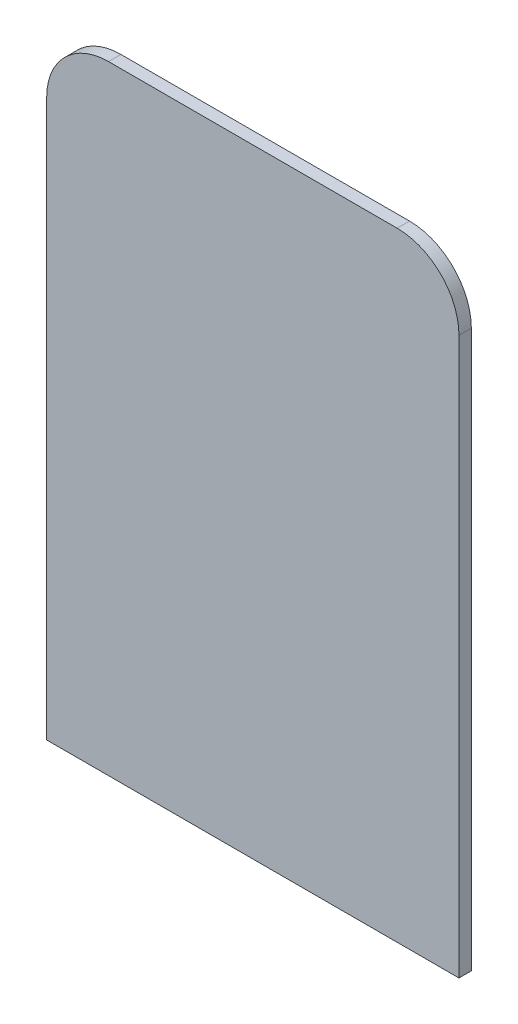
ISO-10303-21;
HEADER;
FILE_DESCRIPTION(('STEP AP214'),'2;1');
FILE_NAME('part.step','',(''),(''),'','','');
FILE_SCHEMA(('AUTOMOTIVE_DESIGN { 1 0 10303 214 1 1 1 1 }'));
ENDSEC;
DATA;
#1=APPLICATION_CONTEXT('core data for automotive mechanical design processes');
#2=APPLICATION_PROTOCOL_DEFINITION('international standard','automotive_design',2000,#1);
#3=PRODUCT_CONTEXT('',#1,'mechanical');
#4=PRODUCT('Part','Part','',(#3));
#5=PRODUCT_RELATED_PRODUCT_CATEGORY('part','',(#4));
#6=PRODUCT_DEFINITION_FORMATION('','',#4);
#7=PRODUCT_DEFINITION_CONTEXT('part definition',#1,'design');
#8=PRODUCT_DEFINITION('design','',#6,#7);
#9=PRODUCT_DEFINITION_SHAPE('','',#8);
#10=(LENGTH_UNIT() NAMED_UNIT(*) SI_UNIT(.MILLI.,.METRE.));
#11=(NAMED_UNIT(*) PLANE_ANGLE_UNIT() SI_UNIT($,.RADIAN.));
#12=(NAMED_UNIT(*) SI_UNIT($,.STERADIAN.) SOLID_ANGLE_UNIT());
#13=UNCERTAINTY_MEASURE_WITH_UNIT(LENGTH_MEASURE(1.E-05),#10,'distance_accuracy_value','');
#14=(GEOMETRIC_REPRESENTATION_CONTEXT(3) GLOBAL_UNCERTAINTY_ASSIGNED_CONTEXT((#13)) GLOBAL_UNIT_ASSIGNED_CONTEXT((#10,
#11,#12)) REPRESENTATION_CONTEXT('',''));
#15=CARTESIAN_POINT('',(0.,0.,0.));
#16=DIRECTION('',(0.,0.,1.));
#17=DIRECTION('',(1.,0.,0.));
#18=AXIS2_PLACEMENT_3D('',#15,#16,#17);
#19=CARTESIAN_POINT('',(-50.,-75.,3.));
#20=DIRECTION('',(1.,0.,0.));
#21=DIRECTION('',(0.,0.,-1.));
#22=AXIS2_PLACEMENT_3D('',#19,#20,#21);
#23=PLANE('',#22);
#24=DIRECTION('',(0.,-1.,0.));
#25=VECTOR('',#24,1.);
#26=CARTESIAN_POINT('',(-50.,-75.,0.));
#27=LINE('',#26,#25);
#28=CARTESIAN_POINT('',(-50.,60.,0.));
#29=VERTEX_POINT('',#28);
#30=CARTESIAN_POINT('',(-50.,-75.,0.));
#31=VERTEX_POINT('',#30);
#32=EDGE_CURVE('E117',#29,#31,#27,.T.);
#33=ORIENTED_EDGE('',*,*,#32,.T.);
#34=DIRECTION('',(0.,0.,-1.));
#35=VECTOR('',#34,1.);
#36=CARTESIAN_POINT('',(-50.,-75.,3.));
#37=LINE('',#36,#35);
#38=CARTESIAN_POINT('',(-50.,-75.,3.));
#39=VERTEX_POINT('',#38);
#40=EDGE_CURVE('E11',#39,#31,#37,.T.);
#41=ORIENTED_EDGE('',*,*,#40,.F.);
#42=DIRECTION('',(0.,-1.,0.));
#43=VECTOR('',#42,1.);
#44=CARTESIAN_POINT('',(-50.,-75.,3.));
#45=LINE('',#44,#43);
#46=CARTESIAN_POINT('',(-50.,60.,3.));
#47=VERTEX_POINT('',#46);
#48=EDGE_CURVE('E127',#47,#39,#45,.T.);
#49=ORIENTED_EDGE('',*,*,#48,.F.);
#50=DIRECTION('',(0.,0.,-1.));
#51=VECTOR('',#50,1.);
#52=CARTESIAN_POINT('',(-50.,60.,3.));
#53=LINE('',#52,#51);
#54=EDGE_CURVE('E113',#47,#29,#53,.T.);
#55=ORIENTED_EDGE('',*,*,#54,.T.);
#56=EDGE_LOOP('',(#33,#41,#49,#55));
#57=FACE_BOUND('',#56,.T.);
#58=ADVANCED_FACE('F33',(#57),#23,.F.);
#59=CARTESIAN_POINT('',(-50.,-75.,3.));
#60=DIRECTION('',(0.,1.,0.));
#61=DIRECTION('',(0.,0.,1.));
#62=AXIS2_PLACEMENT_3D('',#59,#60,#61);
#63=PLANE('',#62);
#64=DIRECTION('',(1.,0.,0.));
#65=VECTOR('',#64,1.);
#66=CARTESIAN_POINT('',(-50.,-75.,0.));
#67=LINE('',#66,#65);
#68=CARTESIAN_POINT('',(50.,-75.,0.));
#69=VERTEX_POINT('',#68);
#70=EDGE_CURVE('E120',#31,#69,#67,.T.);
#71=ORIENTED_EDGE('',*,*,#70,.T.);
#72=DIRECTION('',(0.,0.,-1.));
#73=VECTOR('',#72,1.);
#74=CARTESIAN_POINT('',(50.,-75.,3.));
#75=LINE('',#74,#73);
#76=CARTESIAN_POINT('',(50.,-75.,3.));
#77=VERTEX_POINT('',#76);
#78=EDGE_CURVE('E41',#77,#69,#75,.T.);
#79=ORIENTED_EDGE('',*,*,#78,.F.);
#80=DIRECTION('',(1.,0.,0.));
#81=VECTOR('',#80,1.);
#82=CARTESIAN_POINT('',(-50.,-75.,3.));
#83=LINE('',#82,#81);
#84=EDGE_CURVE('E86',#39,#77,#83,.T.);
#85=ORIENTED_EDGE('',*,*,#84,.F.);
#86=ORIENTED_EDGE('',*,*,#40,.T.);
#87=EDGE_LOOP('',(#71,#79,#85,#86));
#88=FACE_BOUND('',#87,.T.);
#89=ADVANCED_FACE('F151',(#88),#63,.F.);
#90=CARTESIAN_POINT('',(50.,-75.,3.));
#91=DIRECTION('',(-1.,0.,0.));
#92=DIRECTION('',(0.,0.,1.));
#93=AXIS2_PLACEMENT_3D('',#90,#91,#92);
#94=PLANE('',#93);
#95=DIRECTION('',(0.,1.,0.));
#96=VECTOR('',#95,1.);
#97=CARTESIAN_POINT('',(50.,-75.,0.));
#98=LINE('',#97,#96);
#99=CARTESIAN_POINT('',(50.,60.,0.));
#100=VERTEX_POINT('',#99);
#101=EDGE_CURVE('E122',#69,#100,#98,.T.);
#102=ORIENTED_EDGE('',*,*,#101,.T.);
#103=DIRECTION('',(0.,0.,-1.));
#104=VECTOR('',#103,1.);
#105=CARTESIAN_POINT('',(50.,60.,3.));
#106=LINE('',#105,#104);
#107=CARTESIAN_POINT('',(50.,60.,3.));
#108=VERTEX_POINT('',#107);
#109=EDGE_CURVE('E108',#108,#100,#106,.T.);
#110=ORIENTED_EDGE('',*,*,#109,.F.);
#111=DIRECTION('',(0.,1.,0.));
#112=VECTOR('',#111,1.);
#113=CARTESIAN_POINT('',(50.,-75.,3.));
#114=LINE('',#113,#112);
#115=EDGE_CURVE('E99',#77,#108,#114,.T.);
#116=ORIENTED_EDGE('',*,*,#115,.F.);
#117=ORIENTED_EDGE('',*,*,#78,.T.);
#118=EDGE_LOOP('',(#102,#110,#116,#117));
#119=FACE_BOUND('',#118,.T.);
#120=ADVANCED_FACE('F133',(#119),#94,.F.);
#121=CARTESIAN_POINT('',(35.,60.,3.));
#122=DIRECTION('',(0.,0.,-1.));
#123=DIRECTION('',(-1.,0.,0.));
#124=AXIS2_PLACEMENT_3D('',#121,#122,#123);
#125=CYLINDRICAL_SURFACE('',#124,15.);
#126=CARTESIAN_POINT('',(35.,60.,0.));
#127=DIRECTION('',(0.,0.,1.));
#128=DIRECTION('',(1.,0.,0.));
#129=AXIS2_PLACEMENT_3D('',#126,#127,#128);
#130=CIRCLE('',#129,15.);
#131=CARTESIAN_POINT('',(35.,75.,0.));
#132=VERTEX_POINT('',#131);
#133=EDGE_CURVE('E107',#100,#132,#130,.T.);
#134=ORIENTED_EDGE('',*,*,#133,.T.);
#135=DIRECTION('',(0.,0.,-1.));
#136=VECTOR('',#135,1.);
#137=CARTESIAN_POINT('',(35.,75.,3.));
#138=LINE('',#137,#136);
#139=CARTESIAN_POINT('',(35.,75.,3.));
#140=VERTEX_POINT('',#139);
#141=EDGE_CURVE('E104',#140,#132,#138,.T.);
#142=ORIENTED_EDGE('',*,*,#141,.F.);
#143=CARTESIAN_POINT('',(35.,60.,3.));
#144=DIRECTION('',(0.,0.,1.));
#145=DIRECTION('',(1.,0.,0.));
#146=AXIS2_PLACEMENT_3D('',#143,#144,#145);
#147=CIRCLE('',#146,15.);
#148=EDGE_CURVE('E93',#108,#140,#147,.T.);
#149=ORIENTED_EDGE('',*,*,#148,.F.);
#150=ORIENTED_EDGE('',*,*,#109,.T.);
#151=EDGE_LOOP('',(#134,#142,#149,#150));
#152=FACE_BOUND('',#151,.T.);
#153=ADVANCED_FACE('F105',(#152),#125,.T.);
#154=CARTESIAN_POINT('',(-35.,75.,3.));
#155=DIRECTION('',(0.,-1.,0.));
#156=DIRECTION('',(0.,0.,-1.));
#157=AXIS2_PLACEMENT_3D('',#154,#155,#156);
#158=PLANE('',#157);
#159=DIRECTION('',(-1.,0.,0.));
#160=VECTOR('',#159,1.);
#161=CARTESIAN_POINT('',(-35.,75.,0.));
#162=LINE('',#161,#160);
#163=CARTESIAN_POINT('',(-35.,75.,0.));
#164=VERTEX_POINT('',#163);
#165=EDGE_CURVE('E72',#132,#164,#162,.T.);
#166=ORIENTED_EDGE('',*,*,#165,.T.);
#167=DIRECTION('',(0.,0.,-1.));
#168=VECTOR('',#167,1.);
#169=CARTESIAN_POINT('',(-35.,75.,3.));
#170=LINE('',#169,#168);
#171=CARTESIAN_POINT('',(-35.,75.,3.));
#172=VERTEX_POINT('',#171);
#173=EDGE_CURVE('E109',#172,#164,#170,.T.);
#174=ORIENTED_EDGE('',*,*,#173,.F.);
#175=DIRECTION('',(-1.,0.,0.));
#176=VECTOR('',#175,1.);
#177=CARTESIAN_POINT('',(-35.,75.,3.));
#178=LINE('',#177,#176);
#179=EDGE_CURVE('E97',#140,#172,#178,.T.);
#180=ORIENTED_EDGE('',*,*,#179,.F.);
#181=ORIENTED_EDGE('',*,*,#141,.T.);
#182=EDGE_LOOP('',(#166,#174,#180,#181));
#183=FACE_BOUND('',#182,.T.);
#184=ADVANCED_FACE('F111',(#183),#158,.F.);
#185=CARTESIAN_POINT('',(-35.,60.,3.));
#186=DIRECTION('',(0.,0.,-1.));
#187=DIRECTION('',(-1.,0.,0.));
#188=AXIS2_PLACEMENT_3D('',#185,#186,#187);
#189=CYLINDRICAL_SURFACE('',#188,15.);
#190=CARTESIAN_POINT('',(-35.,60.,0.));
#191=DIRECTION('',(0.,0.,1.));
#192=DIRECTION('',(-1.,0.,0.));
#193=AXIS2_PLACEMENT_3D('',#190,#191,#192);
#194=CIRCLE('',#193,15.);
#195=EDGE_CURVE('E78',#164,#29,#194,.T.);
#196=ORIENTED_EDGE('',*,*,#195,.T.);
#197=ORIENTED_EDGE('',*,*,#54,.F.);
#198=CARTESIAN_POINT('',(-35.,60.,3.));
#199=DIRECTION('',(0.,0.,1.));
#200=DIRECTION('',(-1.,0.,0.));
#201=AXIS2_PLACEMENT_3D('',#198,#199,#200);
#202=CIRCLE('',#201,15.);
#203=EDGE_CURVE('E49',#172,#47,#202,.T.);
#204=ORIENTED_EDGE('',*,*,#203,.F.);
#205=ORIENTED_EDGE('',*,*,#173,.T.);
#206=EDGE_LOOP('',(#196,#197,#204,#205));
#207=FACE_BOUND('',#206,.T.);
#208=ADVANCED_FACE('F140',(#207),#189,.T.);
#209=CARTESIAN_POINT('',(-35.,60.,3.));
#210=DIRECTION('',(0.,0.,-1.));
#211=DIRECTION('',(-1.,0.,0.));
#212=AXIS2_PLACEMENT_3D('',#209,#210,#211);
#213=PLANE('',#212);
#214=ORIENTED_EDGE('',*,*,#48,.T.);
#215=ORIENTED_EDGE('',*,*,#84,.T.);
#216=ORIENTED_EDGE('',*,*,#115,.T.);
#217=ORIENTED_EDGE('',*,*,#148,.T.);
#218=ORIENTED_EDGE('',*,*,#179,.T.);
#219=ORIENTED_EDGE('',*,*,#203,.T.);
#220=EDGE_LOOP('',(#214,#215,#216,#217,#218,#219));
#221=FACE_BOUND('',#220,.T.);
#222=ADVANCED_FACE('F95',(#221),#213,.F.);
#223=CARTESIAN_POINT('',(-35.,60.,0.));
#224=DIRECTION('',(0.,0.,-1.));
#225=DIRECTION('',(-1.,0.,0.));
#226=AXIS2_PLACEMENT_3D('',#223,#224,#225);
#227=PLANE('',#226);
#228=ORIENTED_EDGE('',*,*,#32,.F.);
#229=ORIENTED_EDGE('',*,*,#195,.F.);
#230=ORIENTED_EDGE('',*,*,#165,.F.);
#231=ORIENTED_EDGE('',*,*,#133,.F.);
#232=ORIENTED_EDGE('',*,*,#101,.F.);
#233=ORIENTED_EDGE('',*,*,#70,.F.);
#234=EDGE_LOOP('',(#228,#229,#230,#231,#232,#233));
#235=FACE_BOUND('',#234,.T.);
#236=ADVANCED_FACE('F136',(#235),#227,.T.);
#237=CLOSED_SHELL('',(#58,#89,#120,#153,#184,#208,#222,#236));
#238=MANIFOLD_SOLID_BREP('B2',#237);
#239=ADVANCED_BREP_SHAPE_REPRESENTATION('',(#18,#238),#14);
#240=SHAPE_DEFINITION_REPRESENTATION(#9,#239);
ENDSEC;
END-ISO-10303-21;
